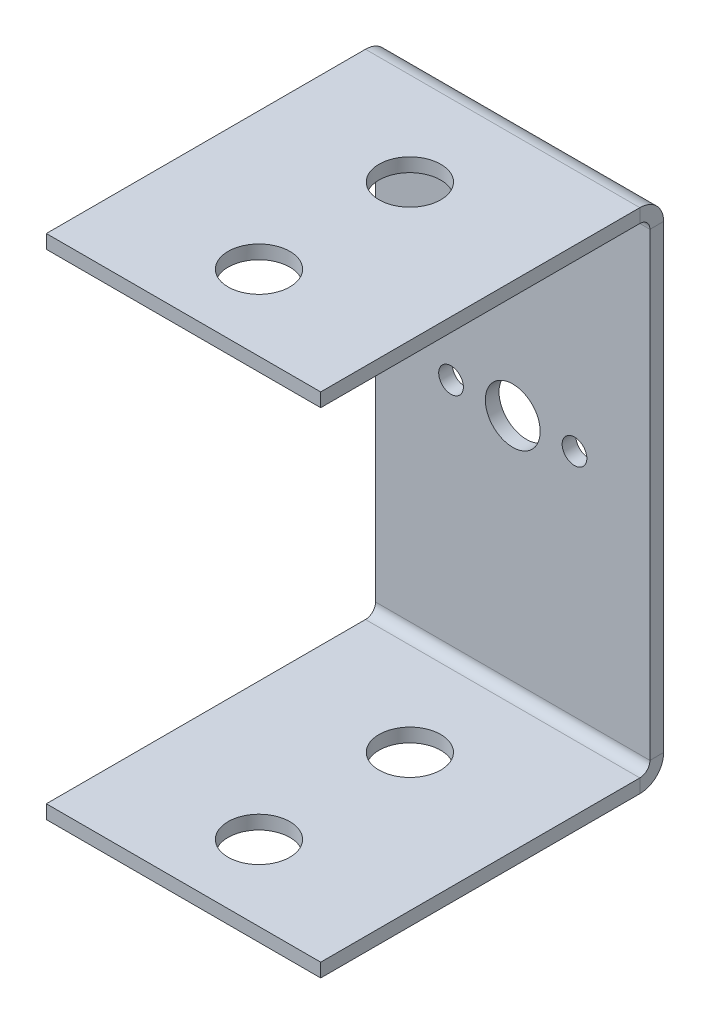
ISO-10303-21;
HEADER;
FILE_DESCRIPTION(('STEP AP214'),'2;1');
FILE_NAME('part.step','',(''),(''),'','','');
FILE_SCHEMA(('AUTOMOTIVE_DESIGN { 1 0 10303 214 1 1 1 1 }'));
ENDSEC;
DATA;
#1=APPLICATION_CONTEXT('core data for automotive mechanical design processes');
#2=APPLICATION_PROTOCOL_DEFINITION('international standard','automotive_design',2000,#1);
#3=PRODUCT_CONTEXT('',#1,'mechanical');
#4=PRODUCT('Part','Part','',(#3));
#5=PRODUCT_RELATED_PRODUCT_CATEGORY('part','',(#4));
#6=PRODUCT_DEFINITION_FORMATION('','',#4);
#7=PRODUCT_DEFINITION_CONTEXT('part definition',#1,'design');
#8=PRODUCT_DEFINITION('design','',#6,#7);
#9=PRODUCT_DEFINITION_SHAPE('','',#8);
#10=(LENGTH_UNIT() NAMED_UNIT(*) SI_UNIT(.MILLI.,.METRE.));
#11=(NAMED_UNIT(*) PLANE_ANGLE_UNIT() SI_UNIT($,.RADIAN.));
#12=(NAMED_UNIT(*) SI_UNIT($,.STERADIAN.) SOLID_ANGLE_UNIT());
#13=UNCERTAINTY_MEASURE_WITH_UNIT(LENGTH_MEASURE(1.E-05),#10,'distance_accuracy_value','');
#14=(GEOMETRIC_REPRESENTATION_CONTEXT(3) GLOBAL_UNCERTAINTY_ASSIGNED_CONTEXT((#13)) GLOBAL_UNIT_ASSIGNED_CONTEXT((#10,
#11,#12)) REPRESENTATION_CONTEXT('',''));
#15=CARTESIAN_POINT('',(0.,0.,0.));
#16=DIRECTION('',(0.,0.,1.));
#17=DIRECTION('',(1.,0.,0.));
#18=AXIS2_PLACEMENT_3D('',#15,#16,#17);
#19=CARTESIAN_POINT('',(0.,0.,-1.));
#20=DIRECTION('',(0.,0.,1.));
#21=DIRECTION('',(1.,0.,0.));
#22=AXIS2_PLACEMENT_3D('',#19,#20,#21);
#23=PLANE('',#22);
#24=CARTESIAN_POINT('',(-4.5,0.,-1.));
#25=DIRECTION('',(0.,0.,-1.));
#26=DIRECTION('',(-1.,0.,0.));
#27=AXIS2_PLACEMENT_3D('',#24,#25,#26);
#28=CIRCLE('',#27,0.899999999999999);
#29=CARTESIAN_POINT('',(-5.4,0.,-1.));
#30=VERTEX_POINT('',#29);
#31=EDGE_CURVE('E325',#30,#30,#28,.T.);
#32=ORIENTED_EDGE('',*,*,#31,.F.);
#33=EDGE_LOOP('',(#32));
#34=FACE_BOUND('',#33,.T.);
#35=CARTESIAN_POINT('',(4.5,0.,-1.));
#36=DIRECTION('',(0.,0.,-1.));
#37=DIRECTION('',(-1.,0.,0.));
#38=AXIS2_PLACEMENT_3D('',#35,#36,#37);
#39=CIRCLE('',#38,0.9);
#40=CARTESIAN_POINT('',(3.6,0.,-1.));
#41=VERTEX_POINT('',#40);
#42=EDGE_CURVE('E326',#41,#41,#39,.T.);
#43=ORIENTED_EDGE('',*,*,#42,.F.);
#44=EDGE_LOOP('',(#43));
#45=FACE_BOUND('',#44,.T.);
#46=CARTESIAN_POINT('',(0.,0.,-1.));
#47=DIRECTION('',(0.,0.,-1.));
#48=DIRECTION('',(-1.,0.,0.));
#49=AXIS2_PLACEMENT_3D('',#46,#47,#48);
#50=CIRCLE('',#49,2.);
#51=CARTESIAN_POINT('',(-2.,0.,-1.));
#52=VERTEX_POINT('',#51);
#53=EDGE_CURVE('E296',#52,#52,#50,.T.);
#54=ORIENTED_EDGE('',*,*,#53,.F.);
#55=EDGE_LOOP('',(#54));
#56=FACE_BOUND('',#55,.T.);
#57=DIRECTION('',(1.,0.,0.));
#58=VECTOR('',#57,1.);
#59=CARTESIAN_POINT('',(10.,-16.7634,-1.));
#60=LINE('',#59,#58);
#61=CARTESIAN_POINT('',(10.,-16.7634,-1.));
#62=VERTEX_POINT('',#61);
#63=CARTESIAN_POINT('',(-10.,-16.7634,-1.));
#64=VERTEX_POINT('',#63);
#65=EDGE_CURVE('E214',#62,#64,#60,.F.);
#66=ORIENTED_EDGE('',*,*,#65,.T.);
#67=DIRECTION('',(0.,-1.,0.));
#68=VECTOR('',#67,1.);
#69=CARTESIAN_POINT('',(-10.,18.5,-1.));
#70=LINE('',#69,#68);
#71=CARTESIAN_POINT('',(-10.,16.7634,-1.));
#72=VERTEX_POINT('',#71);
#73=EDGE_CURVE('E13',#72,#64,#70,.T.);
#74=ORIENTED_EDGE('',*,*,#73,.F.);
#75=DIRECTION('',(-1.,0.,0.));
#76=VECTOR('',#75,1.);
#77=CARTESIAN_POINT('',(-10.,16.7634,-1.));
#78=LINE('',#77,#76);
#79=CARTESIAN_POINT('',(10.,16.7634,-1.));
#80=VERTEX_POINT('',#79);
#81=EDGE_CURVE('E267',#72,#80,#78,.F.);
#82=ORIENTED_EDGE('',*,*,#81,.T.);
#83=DIRECTION('',(0.,1.,0.));
#84=VECTOR('',#83,1.);
#85=CARTESIAN_POINT('',(10.,18.5,-1.));
#86=LINE('',#85,#84);
#87=EDGE_CURVE('E89',#62,#80,#86,.T.);
#88=ORIENTED_EDGE('',*,*,#87,.F.);
#89=EDGE_LOOP('',(#66,#74,#82,#88));
#90=FACE_BOUND('',#89,.T.);
#91=ADVANCED_FACE('F80',(#34,#45,#56,#90),#23,.F.);
#92=CARTESIAN_POINT('',(0.,0.,0.));
#93=DIRECTION('',(0.,0.,1.));
#94=DIRECTION('',(1.,0.,0.));
#95=AXIS2_PLACEMENT_3D('',#92,#93,#94);
#96=PLANE('',#95);
#97=CARTESIAN_POINT('',(-4.5,0.,0.));
#98=DIRECTION('',(0.,0.,1.));
#99=DIRECTION('',(1.,0.,0.));
#100=AXIS2_PLACEMENT_3D('',#97,#98,#99);
#101=CIRCLE('',#100,0.899999999999999);
#102=CARTESIAN_POINT('',(-3.6,0.,0.));
#103=VERTEX_POINT('',#102);
#104=EDGE_CURVE('E213',#103,#103,#101,.T.);
#105=ORIENTED_EDGE('',*,*,#104,.F.);
#106=EDGE_LOOP('',(#105));
#107=FACE_BOUND('',#106,.T.);
#108=CARTESIAN_POINT('',(4.5,0.,0.));
#109=DIRECTION('',(0.,0.,1.));
#110=DIRECTION('',(1.,0.,0.));
#111=AXIS2_PLACEMENT_3D('',#108,#109,#110);
#112=CIRCLE('',#111,0.9);
#113=CARTESIAN_POINT('',(5.4,0.,0.));
#114=VERTEX_POINT('',#113);
#115=EDGE_CURVE('E295',#114,#114,#112,.T.);
#116=ORIENTED_EDGE('',*,*,#115,.F.);
#117=EDGE_LOOP('',(#116));
#118=FACE_BOUND('',#117,.T.);
#119=CARTESIAN_POINT('',(0.,0.,0.));
#120=DIRECTION('',(0.,0.,1.));
#121=DIRECTION('',(1.,0.,0.));
#122=AXIS2_PLACEMENT_3D('',#119,#120,#121);
#123=CIRCLE('',#122,2.);
#124=CARTESIAN_POINT('',(2.,0.,0.));
#125=VERTEX_POINT('',#124);
#126=EDGE_CURVE('E292',#125,#125,#123,.T.);
#127=ORIENTED_EDGE('',*,*,#126,.F.);
#128=EDGE_LOOP('',(#127));
#129=FACE_BOUND('',#128,.T.);
#130=DIRECTION('',(0.,-1.,0.));
#131=VECTOR('',#130,1.);
#132=CARTESIAN_POINT('',(-10.,18.5,0.));
#133=LINE('',#132,#131);
#134=CARTESIAN_POINT('',(-10.,16.7634,0.));
#135=VERTEX_POINT('',#134);
#136=CARTESIAN_POINT('',(-10.,-16.7634,0.));
#137=VERTEX_POINT('',#136);
#138=EDGE_CURVE('E288',#135,#137,#133,.T.);
#139=ORIENTED_EDGE('',*,*,#138,.T.);
#140=DIRECTION('',(1.,0.,0.));
#141=VECTOR('',#140,1.);
#142=CARTESIAN_POINT('',(10.,-16.7634,0.));
#143=LINE('',#142,#141);
#144=CARTESIAN_POINT('',(10.,-16.7634,0.));
#145=VERTEX_POINT('',#144);
#146=EDGE_CURVE('E226',#145,#137,#143,.F.);
#147=ORIENTED_EDGE('',*,*,#146,.F.);
#148=DIRECTION('',(0.,1.,0.));
#149=VECTOR('',#148,1.);
#150=CARTESIAN_POINT('',(10.,18.5,0.));
#151=LINE('',#150,#149);
#152=CARTESIAN_POINT('',(10.,16.7634,0.));
#153=VERTEX_POINT('',#152);
#154=EDGE_CURVE('E285',#145,#153,#151,.T.);
#155=ORIENTED_EDGE('',*,*,#154,.T.);
#156=DIRECTION('',(-1.,0.,0.));
#157=VECTOR('',#156,1.);
#158=CARTESIAN_POINT('',(-10.,16.7634,0.));
#159=LINE('',#158,#157);
#160=EDGE_CURVE('E97',#135,#153,#159,.F.);
#161=ORIENTED_EDGE('',*,*,#160,.F.);
#162=EDGE_LOOP('',(#139,#147,#155,#161));
#163=FACE_BOUND('',#162,.T.);
#164=ADVANCED_FACE('F372',(#107,#118,#129,#163),#96,.T.);
#165=CARTESIAN_POINT('',(10.,18.5,-1.));
#166=DIRECTION('',(1.,0.,0.));
#167=DIRECTION('',(0.,0.,-1.));
#168=AXIS2_PLACEMENT_3D('',#165,#166,#167);
#169=PLANE('',#168);
#170=ORIENTED_EDGE('',*,*,#154,.F.);
#171=DIRECTION('',(0.,0.,-1.));
#172=VECTOR('',#171,1.);
#173=CARTESIAN_POINT('',(10.,-16.7634,0.));
#174=LINE('',#173,#172);
#175=EDGE_CURVE('E220',#145,#62,#174,.T.);
#176=ORIENTED_EDGE('',*,*,#175,.T.);
#177=ORIENTED_EDGE('',*,*,#87,.T.);
#178=DIRECTION('',(0.,0.,-1.));
#179=VECTOR('',#178,1.);
#180=CARTESIAN_POINT('',(10.,16.7634,0.));
#181=LINE('',#180,#179);
#182=EDGE_CURVE('E282',#153,#80,#181,.T.);
#183=ORIENTED_EDGE('',*,*,#182,.F.);
#184=EDGE_LOOP('',(#170,#176,#177,#183));
#185=FACE_BOUND('',#184,.T.);
#186=ADVANCED_FACE('F82',(#185),#169,.T.);
#187=CARTESIAN_POINT('',(-10.,18.5,-1.));
#188=DIRECTION('',(-1.,0.,0.));
#189=DIRECTION('',(0.,0.,1.));
#190=AXIS2_PLACEMENT_3D('',#187,#188,#189);
#191=PLANE('',#190);
#192=DIRECTION('',(0.,0.,-1.));
#193=VECTOR('',#192,1.);
#194=CARTESIAN_POINT('',(-10.,-16.7634,0.));
#195=LINE('',#194,#193);
#196=EDGE_CURVE('E232',#137,#64,#195,.T.);
#197=ORIENTED_EDGE('',*,*,#196,.F.);
#198=ORIENTED_EDGE('',*,*,#138,.F.);
#199=DIRECTION('',(0.,0.,-1.));
#200=VECTOR('',#199,1.);
#201=CARTESIAN_POINT('',(-10.,16.7634,0.));
#202=LINE('',#201,#200);
#203=EDGE_CURVE('E273',#135,#72,#202,.T.);
#204=ORIENTED_EDGE('',*,*,#203,.T.);
#205=ORIENTED_EDGE('',*,*,#73,.T.);
#206=EDGE_LOOP('',(#197,#198,#204,#205));
#207=FACE_BOUND('',#206,.T.);
#208=ADVANCED_FACE('F354',(#207),#191,.T.);
#209=CARTESIAN_POINT('',(10.,16.7634,0.7366));
#210=DIRECTION('',(1.,0.,0.));
#211=DIRECTION('',(0.,0.,-1.));
#212=AXIS2_PLACEMENT_3D('',#209,#210,#211);
#213=PLANE('',#212);
#214=DIRECTION('',(0.,-1.,0.));
#215=VECTOR('',#214,1.);
#216=CARTESIAN_POINT('',(10.,18.5,0.736599999999993));
#217=LINE('',#216,#215);
#218=CARTESIAN_POINT('',(10.,17.5,0.736599999999997));
#219=VERTEX_POINT('',#218);
#220=CARTESIAN_POINT('',(10.,18.5,0.736599999999993));
#221=VERTEX_POINT('',#220);
#222=EDGE_CURVE('E235',#219,#221,#217,.F.);
#223=ORIENTED_EDGE('',*,*,#222,.F.);
#224=CARTESIAN_POINT('',(10.,16.7634,0.7366));
#225=DIRECTION('',(-1.,0.,0.));
#226=DIRECTION('',(0.,0.,1.));
#227=AXIS2_PLACEMENT_3D('',#224,#225,#226);
#228=CIRCLE('',#227,0.7366);
#229=EDGE_CURVE('E276',#153,#219,#228,.F.);
#230=ORIENTED_EDGE('',*,*,#229,.F.);
#231=ORIENTED_EDGE('',*,*,#182,.T.);
#232=CARTESIAN_POINT('',(10.,16.7634,0.7366));
#233=DIRECTION('',(-1.,0.,0.));
#234=DIRECTION('',(0.,0.,1.));
#235=AXIS2_PLACEMENT_3D('',#232,#233,#234);
#236=CIRCLE('',#235,1.7366);
#237=EDGE_CURVE('E269',#80,#221,#236,.F.);
#238=ORIENTED_EDGE('',*,*,#237,.T.);
#239=EDGE_LOOP('',(#223,#230,#231,#238));
#240=FACE_BOUND('',#239,.T.);
#241=ADVANCED_FACE('F386',(#240),#213,.T.);
#242=CARTESIAN_POINT('',(-10.,16.7634,0.7366));
#243=DIRECTION('',(1.,0.,0.));
#244=DIRECTION('',(0.,0.,-1.));
#245=AXIS2_PLACEMENT_3D('',#242,#243,#244);
#246=PLANE('',#245);
#247=CARTESIAN_POINT('',(-10.,16.7634,0.7366));
#248=DIRECTION('',(-1.,0.,0.));
#249=DIRECTION('',(0.,0.,1.));
#250=AXIS2_PLACEMENT_3D('',#247,#248,#249);
#251=CIRCLE('',#250,0.7366);
#252=CARTESIAN_POINT('',(-10.,17.5,0.736599999999997));
#253=VERTEX_POINT('',#252);
#254=EDGE_CURVE('E240',#253,#135,#251,.T.);
#255=ORIENTED_EDGE('',*,*,#254,.F.);
#256=DIRECTION('',(0.,-1.,0.));
#257=VECTOR('',#256,1.);
#258=CARTESIAN_POINT('',(-10.,17.5,0.736599999999997));
#259=LINE('',#258,#257);
#260=CARTESIAN_POINT('',(-10.,18.5,0.736599999999993));
#261=VERTEX_POINT('',#260);
#262=EDGE_CURVE('E260',#253,#261,#259,.F.);
#263=ORIENTED_EDGE('',*,*,#262,.T.);
#264=CARTESIAN_POINT('',(-10.,16.7634,0.7366));
#265=DIRECTION('',(-1.,0.,0.));
#266=DIRECTION('',(0.,0.,1.));
#267=AXIS2_PLACEMENT_3D('',#264,#265,#266);
#268=CIRCLE('',#267,1.7366);
#269=EDGE_CURVE('E270',#261,#72,#268,.T.);
#270=ORIENTED_EDGE('',*,*,#269,.T.);
#271=ORIENTED_EDGE('',*,*,#203,.F.);
#272=EDGE_LOOP('',(#255,#263,#270,#271));
#273=FACE_BOUND('',#272,.T.);
#274=ADVANCED_FACE('F383',(#273),#246,.F.);
#275=CARTESIAN_POINT('',(-10.,16.7634,0.7366));
#276=DIRECTION('',(-1.,0.,0.));
#277=DIRECTION('',(0.,1.,0.));
#278=AXIS2_PLACEMENT_3D('',#275,#276,#277);
#279=CYLINDRICAL_SURFACE('',#278,1.7366);
#280=ORIENTED_EDGE('',*,*,#81,.F.);
#281=ORIENTED_EDGE('',*,*,#269,.F.);
#282=DIRECTION('',(-1.,0.,0.));
#283=VECTOR('',#282,1.);
#284=CARTESIAN_POINT('',(10.,18.5,0.736599999999993));
#285=LINE('',#284,#283);
#286=EDGE_CURVE('E258',#261,#221,#285,.F.);
#287=ORIENTED_EDGE('',*,*,#286,.T.);
#288=ORIENTED_EDGE('',*,*,#237,.F.);
#289=EDGE_LOOP('',(#280,#281,#287,#288));
#290=FACE_BOUND('',#289,.T.);
#291=ADVANCED_FACE('F670',(#290),#279,.T.);
#292=CARTESIAN_POINT('',(-10.,16.7634,0.7366));
#293=DIRECTION('',(-1.,0.,0.));
#294=DIRECTION('',(0.,1.,0.));
#295=AXIS2_PLACEMENT_3D('',#292,#293,#294);
#296=CYLINDRICAL_SURFACE('',#295,0.7366);
#297=ORIENTED_EDGE('',*,*,#160,.T.);
#298=ORIENTED_EDGE('',*,*,#229,.T.);
#299=DIRECTION('',(-1.,0.,0.));
#300=VECTOR('',#299,1.);
#301=CARTESIAN_POINT('',(10.,17.5,0.736599999999997));
#302=LINE('',#301,#300);
#303=EDGE_CURVE('E263',#219,#253,#302,.T.);
#304=ORIENTED_EDGE('',*,*,#303,.T.);
#305=ORIENTED_EDGE('',*,*,#254,.T.);
#306=EDGE_LOOP('',(#297,#298,#304,#305));
#307=FACE_BOUND('',#306,.T.);
#308=ADVANCED_FACE('F658',(#307),#296,.F.);
#309=CARTESIAN_POINT('',(10.,18.5,0.));
#310=DIRECTION('',(-1.,0.,0.));
#311=DIRECTION('',(0.,0.,1.));
#312=AXIS2_PLACEMENT_3D('',#309,#310,#311);
#313=PLANE('',#312);
#314=ORIENTED_EDGE('',*,*,#222,.T.);
#315=DIRECTION('',(0.,0.,-1.));
#316=VECTOR('',#315,1.);
#317=CARTESIAN_POINT('',(10.,18.5,0.));
#318=LINE('',#317,#316);
#319=CARTESIAN_POINT('',(10.,18.5000000000001,24.));
#320=VERTEX_POINT('',#319);
#321=EDGE_CURVE('E248',#320,#221,#318,.T.);
#322=ORIENTED_EDGE('',*,*,#321,.F.);
#323=DIRECTION('',(0.,-1.,0.));
#324=VECTOR('',#323,1.);
#325=CARTESIAN_POINT('',(10.,18.5000000000001,24.));
#326=LINE('',#325,#324);
#327=CARTESIAN_POINT('',(10.,17.5000000000001,24.));
#328=VERTEX_POINT('',#327);
#329=EDGE_CURVE('E241',#320,#328,#326,.T.);
#330=ORIENTED_EDGE('',*,*,#329,.T.);
#331=DIRECTION('',(0.,0.,1.));
#332=VECTOR('',#331,1.);
#333=CARTESIAN_POINT('',(10.,17.5,0.));
#334=LINE('',#333,#332);
#335=EDGE_CURVE('E255',#328,#219,#334,.F.);
#336=ORIENTED_EDGE('',*,*,#335,.T.);
#337=EDGE_LOOP('',(#314,#322,#330,#336));
#338=FACE_BOUND('',#337,.T.);
#339=ADVANCED_FACE('F646',(#338),#313,.F.);
#340=CARTESIAN_POINT('',(-10.,18.5000000000001,24.));
#341=DIRECTION('',(1.,0.,0.));
#342=DIRECTION('',(0.,0.,-1.));
#343=AXIS2_PLACEMENT_3D('',#340,#341,#342);
#344=PLANE('',#343);
#345=ORIENTED_EDGE('',*,*,#262,.F.);
#346=DIRECTION('',(0.,0.,-1.));
#347=VECTOR('',#346,1.);
#348=CARTESIAN_POINT('',(-10.,17.5000000000001,24.));
#349=LINE('',#348,#347);
#350=CARTESIAN_POINT('',(-10.,17.5000000000001,24.));
#351=VERTEX_POINT('',#350);
#352=EDGE_CURVE('E253',#253,#351,#349,.F.);
#353=ORIENTED_EDGE('',*,*,#352,.T.);
#354=DIRECTION('',(0.,-1.,0.));
#355=VECTOR('',#354,1.);
#356=CARTESIAN_POINT('',(-10.,18.5000000000001,24.));
#357=LINE('',#356,#355);
#358=CARTESIAN_POINT('',(-10.,18.5000000000001,24.));
#359=VERTEX_POINT('',#358);
#360=EDGE_CURVE('E237',#359,#351,#357,.T.);
#361=ORIENTED_EDGE('',*,*,#360,.F.);
#362=DIRECTION('',(0.,0.,1.));
#363=VECTOR('',#362,1.);
#364=CARTESIAN_POINT('',(-10.,18.5,0.));
#365=LINE('',#364,#363);
#366=EDGE_CURVE('E246',#261,#359,#365,.T.);
#367=ORIENTED_EDGE('',*,*,#366,.F.);
#368=EDGE_LOOP('',(#345,#353,#361,#367));
#369=FACE_BOUND('',#368,.T.);
#370=ADVANCED_FACE('F452',(#369),#344,.F.);
#371=CARTESIAN_POINT('',(0.,18.5,0.));
#372=DIRECTION('',(0.,-1.,0.));
#373=DIRECTION('',(0.,0.,-1.));
#374=AXIS2_PLACEMENT_3D('',#371,#372,#373);
#375=PLANE('',#374);
#376=CARTESIAN_POINT('',(0.,18.5,7.5));
#377=DIRECTION('',(0.,1.,0.));
#378=DIRECTION('',(0.,0.,1.));
#379=AXIS2_PLACEMENT_3D('',#376,#377,#378);
#380=CIRCLE('',#379,2.25);
#381=CARTESIAN_POINT('',(0.,18.5,9.75));
#382=VERTEX_POINT('',#381);
#383=EDGE_CURVE('E309',#382,#382,#380,.T.);
#384=ORIENTED_EDGE('',*,*,#383,.F.);
#385=EDGE_LOOP('',(#384));
#386=FACE_BOUND('',#385,.T.);
#387=CARTESIAN_POINT('',(0.,18.5000000000001,18.5));
#388=DIRECTION('',(0.,1.,0.));
#389=DIRECTION('',(0.,0.,1.));
#390=AXIS2_PLACEMENT_3D('',#387,#388,#389);
#391=CIRCLE('',#390,2.25);
#392=CARTESIAN_POINT('',(0.,18.5000000000001,20.75));
#393=VERTEX_POINT('',#392);
#394=EDGE_CURVE('E314',#393,#393,#391,.T.);
#395=ORIENTED_EDGE('',*,*,#394,.F.);
#396=EDGE_LOOP('',(#395));
#397=FACE_BOUND('',#396,.T.);
#398=ORIENTED_EDGE('',*,*,#286,.F.);
#399=ORIENTED_EDGE('',*,*,#366,.T.);
#400=DIRECTION('',(1.,0.,0.));
#401=VECTOR('',#400,1.);
#402=CARTESIAN_POINT('',(0.,18.5000000000001,24.));
#403=LINE('',#402,#401);
#404=EDGE_CURVE('E244',#359,#320,#403,.T.);
#405=ORIENTED_EDGE('',*,*,#404,.T.);
#406=ORIENTED_EDGE('',*,*,#321,.T.);
#407=EDGE_LOOP('',(#398,#399,#405,#406));
#408=FACE_BOUND('',#407,.T.);
#409=ADVANCED_FACE('F447',(#386,#397,#408),#375,.F.);
#410=CARTESIAN_POINT('',(0.,17.5,0.));
#411=DIRECTION('',(0.,-1.,0.));
#412=DIRECTION('',(0.,0.,-1.));
#413=AXIS2_PLACEMENT_3D('',#410,#411,#412);
#414=PLANE('',#413);
#415=CARTESIAN_POINT('',(0.,17.5,7.5));
#416=DIRECTION('',(0.,-1.,0.));
#417=DIRECTION('',(0.,0.,-1.));
#418=AXIS2_PLACEMENT_3D('',#415,#416,#417);
#419=CIRCLE('',#418,2.25);
#420=CARTESIAN_POINT('',(0.,17.5,5.25));
#421=VERTEX_POINT('',#420);
#422=EDGE_CURVE('E322',#421,#421,#419,.T.);
#423=ORIENTED_EDGE('',*,*,#422,.F.);
#424=EDGE_LOOP('',(#423));
#425=FACE_BOUND('',#424,.T.);
#426=CARTESIAN_POINT('',(0.,17.5000000000001,18.5));
#427=DIRECTION('',(0.,-1.,0.));
#428=DIRECTION('',(0.,0.,-1.));
#429=AXIS2_PLACEMENT_3D('',#426,#427,#428);
#430=CIRCLE('',#429,2.25);
#431=CARTESIAN_POINT('',(0.,17.5000000000001,16.25));
#432=VERTEX_POINT('',#431);
#433=EDGE_CURVE('E302',#432,#432,#430,.T.);
#434=ORIENTED_EDGE('',*,*,#433,.F.);
#435=EDGE_LOOP('',(#434));
#436=FACE_BOUND('',#435,.T.);
#437=ORIENTED_EDGE('',*,*,#352,.F.);
#438=ORIENTED_EDGE('',*,*,#303,.F.);
#439=ORIENTED_EDGE('',*,*,#335,.F.);
#440=DIRECTION('',(-1.,0.,0.));
#441=VECTOR('',#440,1.);
#442=CARTESIAN_POINT('',(10.,17.5000000000001,24.));
#443=LINE('',#442,#441);
#444=EDGE_CURVE('E251',#351,#328,#443,.F.);
#445=ORIENTED_EDGE('',*,*,#444,.F.);
#446=EDGE_LOOP('',(#437,#438,#439,#445));
#447=FACE_BOUND('',#446,.T.);
#448=ADVANCED_FACE('F367',(#425,#436,#447),#414,.T.);
#449=CARTESIAN_POINT('',(10.,18.5000000000001,24.));
#450=DIRECTION('',(0.,0.,-1.));
#451=DIRECTION('',(0.,1.,0.));
#452=AXIS2_PLACEMENT_3D('',#449,#450,#451);
#453=PLANE('',#452);
#454=ORIENTED_EDGE('',*,*,#444,.T.);
#455=ORIENTED_EDGE('',*,*,#329,.F.);
#456=ORIENTED_EDGE('',*,*,#404,.F.);
#457=ORIENTED_EDGE('',*,*,#360,.T.);
#458=EDGE_LOOP('',(#454,#455,#456,#457));
#459=FACE_BOUND('',#458,.T.);
#460=ADVANCED_FACE('F360',(#459),#453,.F.);
#461=CARTESIAN_POINT('',(-10.,-16.7634,0.7366));
#462=DIRECTION('',(-1.,0.,0.));
#463=DIRECTION('',(0.,0.,1.));
#464=AXIS2_PLACEMENT_3D('',#461,#462,#463);
#465=PLANE('',#464);
#466=DIRECTION('',(0.,-1.,0.));
#467=VECTOR('',#466,1.);
#468=CARTESIAN_POINT('',(-10.,-18.5,0.736599999999993));
#469=LINE('',#468,#467);
#470=CARTESIAN_POINT('',(-10.,-17.5,0.736599999999997));
#471=VERTEX_POINT('',#470);
#472=CARTESIAN_POINT('',(-10.,-18.5,0.736599999999993));
#473=VERTEX_POINT('',#472);
#474=EDGE_CURVE('E179',#471,#473,#469,.T.);
#475=ORIENTED_EDGE('',*,*,#474,.F.);
#476=CARTESIAN_POINT('',(-10.,-16.7634,0.7366));
#477=DIRECTION('',(1.,0.,0.));
#478=DIRECTION('',(0.,0.,-1.));
#479=AXIS2_PLACEMENT_3D('',#476,#477,#478);
#480=CIRCLE('',#479,0.7366);
#481=EDGE_CURVE('E223',#137,#471,#480,.F.);
#482=ORIENTED_EDGE('',*,*,#481,.F.);
#483=ORIENTED_EDGE('',*,*,#196,.T.);
#484=CARTESIAN_POINT('',(-10.,-16.7634,0.7366));
#485=DIRECTION('',(1.,0.,0.));
#486=DIRECTION('',(0.,0.,-1.));
#487=AXIS2_PLACEMENT_3D('',#484,#485,#486);
#488=CIRCLE('',#487,1.7366);
#489=EDGE_CURVE('E216',#64,#473,#488,.F.);
#490=ORIENTED_EDGE('',*,*,#489,.T.);
#491=EDGE_LOOP('',(#475,#482,#483,#490));
#492=FACE_BOUND('',#491,.T.);
#493=ADVANCED_FACE('F358',(#492),#465,.T.);
#494=CARTESIAN_POINT('',(10.,-16.7634,0.7366));
#495=DIRECTION('',(-1.,0.,0.));
#496=DIRECTION('',(0.,0.,1.));
#497=AXIS2_PLACEMENT_3D('',#494,#495,#496);
#498=PLANE('',#497);
#499=CARTESIAN_POINT('',(10.,-16.7634,0.7366));
#500=DIRECTION('',(1.,0.,0.));
#501=DIRECTION('',(0.,0.,-1.));
#502=AXIS2_PLACEMENT_3D('',#499,#500,#501);
#503=CIRCLE('',#502,0.7366);
#504=CARTESIAN_POINT('',(10.,-17.5,0.736599999999997));
#505=VERTEX_POINT('',#504);
#506=EDGE_CURVE('E229',#505,#145,#503,.T.);
#507=ORIENTED_EDGE('',*,*,#506,.F.);
#508=DIRECTION('',(0.,-1.,0.));
#509=VECTOR('',#508,1.);
#510=CARTESIAN_POINT('',(10.,-17.5,0.736599999999997));
#511=LINE('',#510,#509);
#512=CARTESIAN_POINT('',(10.,-18.5,0.736599999999993));
#513=VERTEX_POINT('',#512);
#514=EDGE_CURVE('E207',#505,#513,#511,.T.);
#515=ORIENTED_EDGE('',*,*,#514,.T.);
#516=CARTESIAN_POINT('',(10.,-16.7634,0.7366));
#517=DIRECTION('',(1.,0.,0.));
#518=DIRECTION('',(0.,0.,-1.));
#519=AXIS2_PLACEMENT_3D('',#516,#517,#518);
#520=CIRCLE('',#519,1.7366);
#521=EDGE_CURVE('E217',#513,#62,#520,.T.);
#522=ORIENTED_EDGE('',*,*,#521,.T.);
#523=ORIENTED_EDGE('',*,*,#175,.F.);
#524=EDGE_LOOP('',(#507,#515,#522,#523));
#525=FACE_BOUND('',#524,.T.);
#526=ADVANCED_FACE('F346',(#525),#498,.F.);
#527=CARTESIAN_POINT('',(10.,-16.7634,0.7366));
#528=DIRECTION('',(1.,0.,0.));
#529=DIRECTION('',(0.,-1.,0.));
#530=AXIS2_PLACEMENT_3D('',#527,#528,#529);
#531=CYLINDRICAL_SURFACE('',#530,1.7366);
#532=ORIENTED_EDGE('',*,*,#65,.F.);
#533=ORIENTED_EDGE('',*,*,#521,.F.);
#534=DIRECTION('',(1.,0.,0.));
#535=VECTOR('',#534,1.);
#536=CARTESIAN_POINT('',(-10.,-18.5,0.736599999999993));
#537=LINE('',#536,#535);
#538=EDGE_CURVE('E205',#513,#473,#537,.F.);
#539=ORIENTED_EDGE('',*,*,#538,.T.);
#540=ORIENTED_EDGE('',*,*,#489,.F.);
#541=EDGE_LOOP('',(#532,#533,#539,#540));
#542=FACE_BOUND('',#541,.T.);
#543=ADVANCED_FACE('F351',(#542),#531,.T.);
#544=CARTESIAN_POINT('',(10.,-16.7634,0.7366));
#545=DIRECTION('',(1.,0.,0.));
#546=DIRECTION('',(0.,-1.,0.));
#547=AXIS2_PLACEMENT_3D('',#544,#545,#546);
#548=CYLINDRICAL_SURFACE('',#547,0.7366);
#549=ORIENTED_EDGE('',*,*,#146,.T.);
#550=ORIENTED_EDGE('',*,*,#481,.T.);
#551=DIRECTION('',(1.,0.,0.));
#552=VECTOR('',#551,1.);
#553=CARTESIAN_POINT('',(-10.,-17.5,0.736599999999997));
#554=LINE('',#553,#552);
#555=EDGE_CURVE('E210',#471,#505,#554,.T.);
#556=ORIENTED_EDGE('',*,*,#555,.T.);
#557=ORIENTED_EDGE('',*,*,#506,.T.);
#558=EDGE_LOOP('',(#549,#550,#556,#557));
#559=FACE_BOUND('',#558,.T.);
#560=ADVANCED_FACE('F342',(#559),#548,.F.);
#561=CARTESIAN_POINT('',(10.,-18.5,0.));
#562=DIRECTION('',(1.,0.,0.));
#563=DIRECTION('',(0.,0.,-1.));
#564=AXIS2_PLACEMENT_3D('',#561,#562,#563);
#565=PLANE('',#564);
#566=DIRECTION('',(0.,0.,1.));
#567=VECTOR('',#566,1.);
#568=CARTESIAN_POINT('',(10.,-18.5,0.));
#569=LINE('',#568,#567);
#570=CARTESIAN_POINT('',(10.,-18.5000000000001,24.));
#571=VERTEX_POINT('',#570);
#572=EDGE_CURVE('E195',#571,#513,#569,.F.);
#573=ORIENTED_EDGE('',*,*,#572,.T.);
#574=ORIENTED_EDGE('',*,*,#514,.F.);
#575=DIRECTION('',(0.,0.,-1.));
#576=VECTOR('',#575,1.);
#577=CARTESIAN_POINT('',(10.,-17.5,0.));
#578=LINE('',#577,#576);
#579=CARTESIAN_POINT('',(10.,-17.5000000000001,24.));
#580=VERTEX_POINT('',#579);
#581=EDGE_CURVE('E202',#580,#505,#578,.T.);
#582=ORIENTED_EDGE('',*,*,#581,.F.);
#583=DIRECTION('',(0.,1.,0.));
#584=VECTOR('',#583,1.);
#585=CARTESIAN_POINT('',(10.,-18.5000000000001,24.));
#586=LINE('',#585,#584);
#587=EDGE_CURVE('E190',#571,#580,#586,.T.);
#588=ORIENTED_EDGE('',*,*,#587,.F.);
#589=EDGE_LOOP('',(#573,#574,#582,#588));
#590=FACE_BOUND('',#589,.T.);
#591=ADVANCED_FACE('F336',(#590),#565,.T.);
#592=CARTESIAN_POINT('',(-10.,-18.5000000000001,24.));
#593=DIRECTION('',(-1.,0.,0.));
#594=DIRECTION('',(0.,0.,1.));
#595=AXIS2_PLACEMENT_3D('',#592,#593,#594);
#596=PLANE('',#595);
#597=DIRECTION('',(0.,0.,1.));
#598=VECTOR('',#597,1.);
#599=CARTESIAN_POINT('',(-10.,-17.5,0.));
#600=LINE('',#599,#598);
#601=CARTESIAN_POINT('',(-10.,-17.5000000000001,24.));
#602=VERTEX_POINT('',#601);
#603=EDGE_CURVE('E197',#471,#602,#600,.T.);
#604=ORIENTED_EDGE('',*,*,#603,.F.);
#605=ORIENTED_EDGE('',*,*,#474,.T.);
#606=DIRECTION('',(0.,0.,-1.));
#607=VECTOR('',#606,1.);
#608=CARTESIAN_POINT('',(-10.,-18.5000000000001,24.));
#609=LINE('',#608,#607);
#610=CARTESIAN_POINT('',(-10.,-18.5000000000001,24.));
#611=VERTEX_POINT('',#610);
#612=EDGE_CURVE('E173',#473,#611,#609,.F.);
#613=ORIENTED_EDGE('',*,*,#612,.T.);
#614=DIRECTION('',(0.,1.,0.));
#615=VECTOR('',#614,1.);
#616=CARTESIAN_POINT('',(-10.,-18.5000000000001,24.));
#617=LINE('',#616,#615);
#618=EDGE_CURVE('E177',#611,#602,#617,.T.);
#619=ORIENTED_EDGE('',*,*,#618,.T.);
#620=EDGE_LOOP('',(#604,#605,#613,#619));
#621=FACE_BOUND('',#620,.T.);
#622=ADVANCED_FACE('F176',(#621),#596,.T.);
#623=CARTESIAN_POINT('',(0.,-18.5,0.));
#624=DIRECTION('',(0.,1.,0.));
#625=DIRECTION('',(0.,0.,-1.));
#626=AXIS2_PLACEMENT_3D('',#623,#624,#625);
#627=PLANE('',#626);
#628=CARTESIAN_POINT('',(0.,-18.5000000000001,7.50000000000013));
#629=DIRECTION('',(0.,1.,0.));
#630=DIRECTION('',(0.,0.,1.));
#631=AXIS2_PLACEMENT_3D('',#628,#629,#630);
#632=CIRCLE('',#631,2.25);
#633=CARTESIAN_POINT('',(0.,-18.5000000000001,9.75000000000013));
#634=VERTEX_POINT('',#633);
#635=EDGE_CURVE('E303',#634,#634,#632,.T.);
#636=ORIENTED_EDGE('',*,*,#635,.T.);
#637=EDGE_LOOP('',(#636));
#638=FACE_BOUND('',#637,.T.);
#639=CARTESIAN_POINT('',(0.,-18.5000000000001,18.5000000000001));
#640=DIRECTION('',(0.,1.,0.));
#641=DIRECTION('',(0.,0.,1.));
#642=AXIS2_PLACEMENT_3D('',#639,#640,#641);
#643=CIRCLE('',#642,2.25);
#644=CARTESIAN_POINT('',(0.,-18.5000000000001,20.7500000000001));
#645=VERTEX_POINT('',#644);
#646=EDGE_CURVE('E319',#645,#645,#643,.T.);
#647=ORIENTED_EDGE('',*,*,#646,.T.);
#648=EDGE_LOOP('',(#647));
#649=FACE_BOUND('',#648,.T.);
#650=ORIENTED_EDGE('',*,*,#538,.F.);
#651=ORIENTED_EDGE('',*,*,#572,.F.);
#652=DIRECTION('',(-1.,0.,0.));
#653=VECTOR('',#652,1.);
#654=CARTESIAN_POINT('',(10.,-18.5000000000001,24.));
#655=LINE('',#654,#653);
#656=EDGE_CURVE('E183',#611,#571,#655,.F.);
#657=ORIENTED_EDGE('',*,*,#656,.F.);
#658=ORIENTED_EDGE('',*,*,#612,.F.);
#659=EDGE_LOOP('',(#650,#651,#657,#658));
#660=FACE_BOUND('',#659,.T.);
#661=ADVANCED_FACE('F193',(#638,#649,#660),#627,.F.);
#662=CARTESIAN_POINT('',(0.,-17.5,0.));
#663=DIRECTION('',(0.,1.,0.));
#664=DIRECTION('',(0.,0.,-1.));
#665=AXIS2_PLACEMENT_3D('',#662,#663,#664);
#666=PLANE('',#665);
#667=CARTESIAN_POINT('',(0.,-17.5,7.50000000000012));
#668=DIRECTION('',(0.,1.,0.));
#669=DIRECTION('',(0.,0.,1.));
#670=AXIS2_PLACEMENT_3D('',#667,#668,#669);
#671=CIRCLE('',#670,2.25);
#672=CARTESIAN_POINT('',(0.,-17.5,9.75000000000012));
#673=VERTEX_POINT('',#672);
#674=EDGE_CURVE('E84',#673,#673,#671,.T.);
#675=ORIENTED_EDGE('',*,*,#674,.F.);
#676=EDGE_LOOP('',(#675));
#677=FACE_BOUND('',#676,.T.);
#678=CARTESIAN_POINT('',(0.,-17.5000000000001,18.5000000000001));
#679=DIRECTION('',(0.,1.,0.));
#680=DIRECTION('',(0.,0.,1.));
#681=AXIS2_PLACEMENT_3D('',#678,#679,#680);
#682=CIRCLE('',#681,2.25);
#683=CARTESIAN_POINT('',(0.,-17.5000000000001,20.7500000000001));
#684=VERTEX_POINT('',#683);
#685=EDGE_CURVE('E300',#684,#684,#682,.T.);
#686=ORIENTED_EDGE('',*,*,#685,.F.);
#687=EDGE_LOOP('',(#686));
#688=FACE_BOUND('',#687,.T.);
#689=ORIENTED_EDGE('',*,*,#581,.T.);
#690=ORIENTED_EDGE('',*,*,#555,.F.);
#691=ORIENTED_EDGE('',*,*,#603,.T.);
#692=DIRECTION('',(1.,0.,0.));
#693=VECTOR('',#692,1.);
#694=CARTESIAN_POINT('',(0.,-17.5000000000001,24.));
#695=LINE('',#694,#693);
#696=EDGE_CURVE('E189',#602,#580,#695,.T.);
#697=ORIENTED_EDGE('',*,*,#696,.T.);
#698=EDGE_LOOP('',(#689,#690,#691,#697));
#699=FACE_BOUND('',#698,.T.);
#700=ADVANCED_FACE('F339',(#677,#688,#699),#666,.T.);
#701=CARTESIAN_POINT('',(10.,-18.5000000000001,24.));
#702=DIRECTION('',(0.,0.,1.));
#703=DIRECTION('',(0.,-1.,0.));
#704=AXIS2_PLACEMENT_3D('',#701,#702,#703);
#705=PLANE('',#704);
#706=ORIENTED_EDGE('',*,*,#696,.F.);
#707=ORIENTED_EDGE('',*,*,#618,.F.);
#708=ORIENTED_EDGE('',*,*,#656,.T.);
#709=ORIENTED_EDGE('',*,*,#587,.T.);
#710=EDGE_LOOP('',(#706,#707,#708,#709));
#711=FACE_BOUND('',#710,.T.);
#712=ADVANCED_FACE('F187',(#711),#705,.T.);
#713=CARTESIAN_POINT('',(0.,0.,9.));
#714=DIRECTION('',(0.,0.,-1.));
#715=DIRECTION('',(-1.,0.,0.));
#716=AXIS2_PLACEMENT_3D('',#713,#714,#715);
#717=CYLINDRICAL_SURFACE('',#716,2.);
#718=ORIENTED_EDGE('',*,*,#126,.T.);
#719=EDGE_LOOP('',(#718));
#720=FACE_BOUND('',#719,.T.);
#721=ORIENTED_EDGE('',*,*,#53,.T.);
#722=EDGE_LOOP('',(#721));
#723=FACE_BOUND('',#722,.T.);
#724=ADVANCED_FACE('F409',(#720,#723),#717,.F.);
#725=CARTESIAN_POINT('',(4.5,0.,9.));
#726=DIRECTION('',(0.,0.,-1.));
#727=DIRECTION('',(-1.,0.,0.));
#728=AXIS2_PLACEMENT_3D('',#725,#726,#727);
#729=CYLINDRICAL_SURFACE('',#728,0.9);
#730=ORIENTED_EDGE('',*,*,#115,.T.);
#731=EDGE_LOOP('',(#730));
#732=FACE_BOUND('',#731,.T.);
#733=ORIENTED_EDGE('',*,*,#42,.T.);
#734=EDGE_LOOP('',(#733));
#735=FACE_BOUND('',#734,.T.);
#736=ADVANCED_FACE('F414',(#732,#735),#729,.F.);
#737=CARTESIAN_POINT('',(-4.5,0.,9.));
#738=DIRECTION('',(0.,0.,-1.));
#739=DIRECTION('',(-1.,0.,0.));
#740=AXIS2_PLACEMENT_3D('',#737,#738,#739);
#741=CYLINDRICAL_SURFACE('',#740,0.899999999999999);
#742=ORIENTED_EDGE('',*,*,#104,.T.);
#743=EDGE_LOOP('',(#742));
#744=FACE_BOUND('',#743,.T.);
#745=ORIENTED_EDGE('',*,*,#31,.T.);
#746=EDGE_LOOP('',(#745));
#747=FACE_BOUND('',#746,.T.);
#748=ADVANCED_FACE('F427',(#744,#747),#741,.F.);
#749=CARTESIAN_POINT('',(0.,-18.5000000000001,18.5000000000001));
#750=DIRECTION('',(0.,1.,0.));
#751=DIRECTION('',(0.,0.,1.));
#752=AXIS2_PLACEMENT_3D('',#749,#750,#751);
#753=CYLINDRICAL_SURFACE('',#752,2.25);
#754=ORIENTED_EDGE('',*,*,#685,.T.);
#755=EDGE_LOOP('',(#754));
#756=FACE_BOUND('',#755,.T.);
#757=ORIENTED_EDGE('',*,*,#646,.F.);
#758=EDGE_LOOP('',(#757));
#759=FACE_BOUND('',#758,.T.);
#760=ADVANCED_FACE('F438',(#756,#759),#753,.F.);
#761=CARTESIAN_POINT('',(0.,-18.5000000000001,7.50000000000013));
#762=DIRECTION('',(0.,1.,0.));
#763=DIRECTION('',(0.,0.,1.));
#764=AXIS2_PLACEMENT_3D('',#761,#762,#763);
#765=CYLINDRICAL_SURFACE('',#764,2.25);
#766=ORIENTED_EDGE('',*,*,#674,.T.);
#767=EDGE_LOOP('',(#766));
#768=FACE_BOUND('',#767,.T.);
#769=ORIENTED_EDGE('',*,*,#635,.F.);
#770=EDGE_LOOP('',(#769));
#771=FACE_BOUND('',#770,.T.);
#772=ADVANCED_FACE('F495',(#768,#771),#765,.F.);
#773=ORIENTED_EDGE('',*,*,#433,.T.);
#774=EDGE_LOOP('',(#773));
#775=FACE_BOUND('',#774,.T.);
#776=ORIENTED_EDGE('',*,*,#394,.T.);
#777=EDGE_LOOP('',(#776));
#778=FACE_BOUND('',#777,.T.);
#779=ADVANCED_FACE('F497',(#775,#778),#753,.F.);
#780=ORIENTED_EDGE('',*,*,#422,.T.);
#781=EDGE_LOOP('',(#780));
#782=FACE_BOUND('',#781,.T.);
#783=ORIENTED_EDGE('',*,*,#383,.T.);
#784=EDGE_LOOP('',(#783));
#785=FACE_BOUND('',#784,.T.);
#786=ADVANCED_FACE('F508',(#782,#785),#765,.F.);
#787=CLOSED_SHELL('',(#91,#164,#186,#208,#241,#274,#291,#308,#339,#370,#409,#448,#460,#493,#526,
#543,#560,#591,#622,#661,#700,#712,#724,#736,#748,#760,#772,#779,#786));
#788=MANIFOLD_SOLID_BREP('B2',#787);
#789=ADVANCED_BREP_SHAPE_REPRESENTATION('',(#18,#788),#14);
#790=SHAPE_DEFINITION_REPRESENTATION(#9,#789);
ENDSEC;
END-ISO-10303-21;
